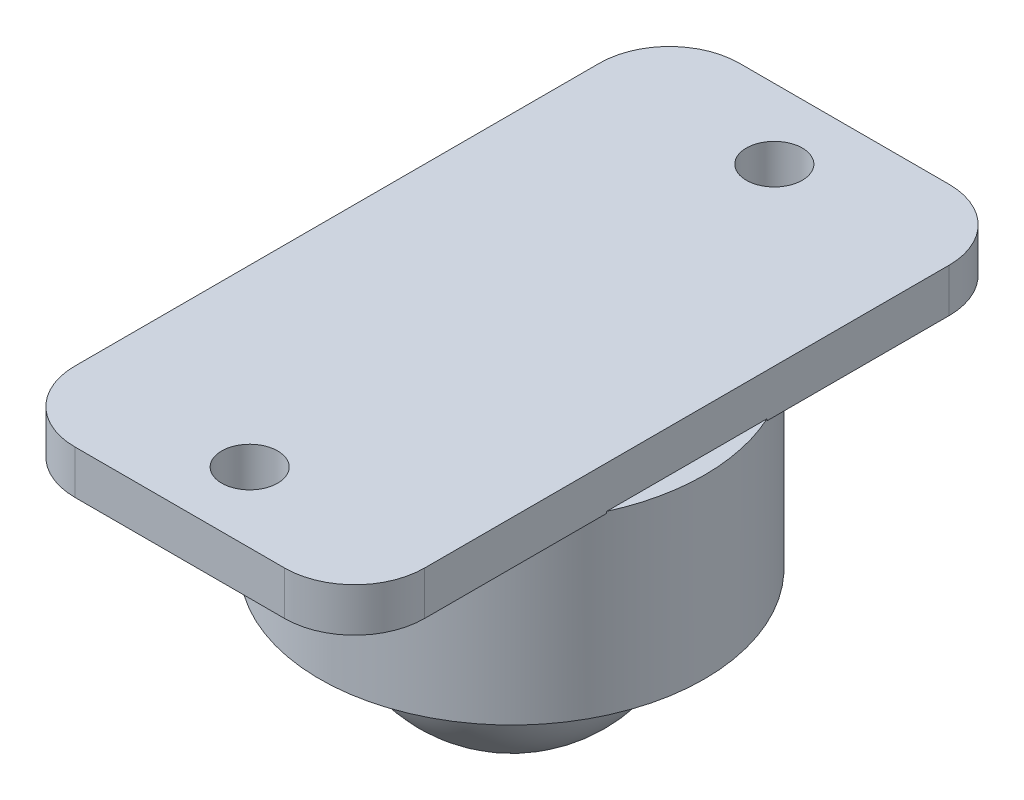
ISO-10303-21;
HEADER;
FILE_DESCRIPTION(('STEP AP214'),'2;1');
FILE_NAME('part.step','',(''),(''),'','','');
FILE_SCHEMA(('AUTOMOTIVE_DESIGN { 1 0 10303 214 1 1 1 1 }'));
ENDSEC;
DATA;
#1=APPLICATION_CONTEXT('core data for automotive mechanical design processes');
#2=APPLICATION_PROTOCOL_DEFINITION('international standard','automotive_design',2000,#1);
#3=PRODUCT_CONTEXT('',#1,'mechanical');
#4=PRODUCT('Part','Part','',(#3));
#5=PRODUCT_RELATED_PRODUCT_CATEGORY('part','',(#4));
#6=PRODUCT_DEFINITION_FORMATION('','',#4);
#7=PRODUCT_DEFINITION_CONTEXT('part definition',#1,'design');
#8=PRODUCT_DEFINITION('design','',#6,#7);
#9=PRODUCT_DEFINITION_SHAPE('','',#8);
#10=(LENGTH_UNIT() NAMED_UNIT(*) SI_UNIT(.MILLI.,.METRE.));
#11=(NAMED_UNIT(*) PLANE_ANGLE_UNIT() SI_UNIT($,.RADIAN.));
#12=(NAMED_UNIT(*) SI_UNIT($,.STERADIAN.) SOLID_ANGLE_UNIT());
#13=UNCERTAINTY_MEASURE_WITH_UNIT(LENGTH_MEASURE(1.E-05),#10,'distance_accuracy_value','');
#14=(GEOMETRIC_REPRESENTATION_CONTEXT(3) GLOBAL_UNCERTAINTY_ASSIGNED_CONTEXT((#13)) GLOBAL_UNIT_ASSIGNED_CONTEXT((#10,
#11,#12)) REPRESENTATION_CONTEXT('',''));
#15=CARTESIAN_POINT('',(0.,0.,0.));
#16=DIRECTION('',(0.,0.,1.));
#17=DIRECTION('',(1.,0.,0.));
#18=AXIS2_PLACEMENT_3D('',#15,#16,#17);
#19=CARTESIAN_POINT('',(283.05,457.1,512.72));
#20=DIRECTION('',(0.,0.,1.));
#21=DIRECTION('',(1.,0.,0.));
#22=AXIS2_PLACEMENT_3D('',#19,#20,#21);
#23=SPHERICAL_SURFACE('',#22,7.8);
#24=CARTESIAN_POINT('',(283.05,457.1,512.72));
#25=DIRECTION('',(0.,-1.,0.));
#26=DIRECTION('',(1.,0.,0.));
#27=AXIS2_PLACEMENT_3D('',#24,#25,#26);
#28=SPHERICAL_SURFACE('',#27,7.8);
#29=CARTESIAN_POINT('',(283.05,457.1,512.72));
#30=DIRECTION('',(0.,-1.,0.));
#31=DIRECTION('',(1.,0.,0.));
#32=AXIS2_PLACEMENT_3D('',#29,#30,#31);
#33=CIRCLE('',#32,7.8);
#34=CARTESIAN_POINT('',(283.05,457.1,504.92));
#35=VERTEX_POINT('',#34);
#36=CARTESIAN_POINT('',(283.05,457.1,520.52));
#37=VERTEX_POINT('',#36);
#38=EDGE_CURVE('P0_E38',#35,#37,#33,.T.);
#39=ORIENTED_EDGE('',*,*,#38,.T.);
#40=CARTESIAN_POINT('',(283.05,457.1,512.72));
#41=DIRECTION('',(0.,-1.,0.));
#42=DIRECTION('',(0.,0.,-1.));
#43=AXIS2_PLACEMENT_3D('',#40,#41,#42);
#44=CIRCLE('',#43,7.8);
#45=EDGE_CURVE('P0_E168',#37,#35,#44,.T.);
#46=ORIENTED_EDGE('',*,*,#45,.T.);
#47=EDGE_LOOP('',(#39,#46));
#48=FACE_BOUND('',#47,.T.);
#49=ADVANCED_FACE('P0_F17',(#48),#28,.F.);
#50=CARTESIAN_POINT('',(283.05,464.6,527.72));
#51=DIRECTION('',(0.,-1.,0.));
#52=DIRECTION('',(1.,0.,0.));
#53=AXIS2_PLACEMENT_3D('',#50,#51,#52);
#54=CYLINDRICAL_SURFACE('',#53,1.6);
#55=DIRECTION('',(0.,1.,0.));
#56=VECTOR('',#55,1.);
#57=CARTESIAN_POINT('',(284.65,464.6,527.72));
#58=LINE('',#57,#56);
#59=CARTESIAN_POINT('',(284.65,467.1,527.72));
#60=VERTEX_POINT('',#59);
#61=CARTESIAN_POINT('',(284.65,469.6,527.72));
#62=VERTEX_POINT('',#61);
#63=EDGE_CURVE('P0_E11',#60,#62,#58,.T.);
#64=ORIENTED_EDGE('',*,*,#63,.T.);
#65=CARTESIAN_POINT('',(283.05,469.6,527.72));
#66=DIRECTION('',(0.,-1.,0.));
#67=DIRECTION('',(1.,0.,0.));
#68=AXIS2_PLACEMENT_3D('',#65,#66,#67);
#69=CIRCLE('',#68,1.6);
#70=EDGE_CURVE('P0_E175',#62,#62,#69,.T.);
#71=ORIENTED_EDGE('',*,*,#70,.F.);
#72=ORIENTED_EDGE('',*,*,#63,.F.);
#73=CARTESIAN_POINT('',(283.05,467.1,527.72));
#74=DIRECTION('',(0.,-1.,0.));
#75=DIRECTION('',(1.,0.,0.));
#76=AXIS2_PLACEMENT_3D('',#73,#74,#75);
#77=CIRCLE('',#76,1.6);
#78=EDGE_CURVE('P0_E247',#60,#60,#77,.T.);
#79=ORIENTED_EDGE('',*,*,#78,.T.);
#80=EDGE_LOOP('',(#64,#71,#72,#79));
#81=FACE_BOUND('',#80,.T.);
#82=ADVANCED_FACE('P0_F391',(#81),#54,.F.);
#83=CARTESIAN_POINT('',(273.05,467.1,531.72));
#84=DIRECTION('',(0.,0.,1.));
#85=DIRECTION('',(1.,0.,0.));
#86=AXIS2_PLACEMENT_3D('',#83,#84,#85);
#87=PLANE('',#86);
#88=DIRECTION('',(1.,0.,0.));
#89=VECTOR('',#88,1.);
#90=CARTESIAN_POINT('',(273.05,469.6,531.72));
#91=LINE('',#90,#89);
#92=CARTESIAN_POINT('',(277.05,469.6,531.72));
#93=VERTEX_POINT('',#92);
#94=CARTESIAN_POINT('',(289.05,469.6,531.72));
#95=VERTEX_POINT('',#94);
#96=EDGE_CURVE('P0_E261',#93,#95,#91,.T.);
#97=ORIENTED_EDGE('',*,*,#96,.F.);
#98=DIRECTION('',(0.,1.,0.));
#99=VECTOR('',#98,1.);
#100=CARTESIAN_POINT('',(277.05,467.1,531.72));
#101=LINE('',#100,#99);
#102=CARTESIAN_POINT('',(277.05,467.1,531.72));
#103=VERTEX_POINT('',#102);
#104=EDGE_CURVE('P0_E251',#103,#93,#101,.T.);
#105=ORIENTED_EDGE('',*,*,#104,.F.);
#106=DIRECTION('',(1.,0.,0.));
#107=VECTOR('',#106,1.);
#108=CARTESIAN_POINT('',(273.05,467.1,531.72));
#109=LINE('',#108,#107);
#110=CARTESIAN_POINT('',(289.05,467.1,531.72));
#111=VERTEX_POINT('',#110);
#112=EDGE_CURVE('P0_E229',#103,#111,#109,.T.);
#113=ORIENTED_EDGE('',*,*,#112,.T.);
#114=DIRECTION('',(0.,1.,0.));
#115=VECTOR('',#114,1.);
#116=CARTESIAN_POINT('',(289.05,467.1,531.72));
#117=LINE('',#116,#115);
#118=EDGE_CURVE('P0_E26',#111,#95,#117,.T.);
#119=ORIENTED_EDGE('',*,*,#118,.T.);
#120=EDGE_LOOP('',(#97,#105,#113,#119));
#121=FACE_BOUND('',#120,.T.);
#122=ADVANCED_FACE('P0_F389',(#121),#87,.T.);
#123=CARTESIAN_POINT('',(289.05,467.1,527.72));
#124=DIRECTION('',(0.,1.,0.));
#125=DIRECTION('',(1.,0.,0.));
#126=AXIS2_PLACEMENT_3D('',#123,#124,#125);
#127=CYLINDRICAL_SURFACE('',#126,4.);
#128=DIRECTION('',(0.,1.,0.));
#129=VECTOR('',#128,1.);
#130=CARTESIAN_POINT('',(293.05,467.1,527.72));
#131=LINE('',#130,#129);
#132=CARTESIAN_POINT('',(293.05,467.1,527.72));
#133=VERTEX_POINT('',#132);
#134=CARTESIAN_POINT('',(293.05,469.6,527.72));
#135=VERTEX_POINT('',#134);
#136=EDGE_CURVE('P0_E196',#133,#135,#131,.T.);
#137=ORIENTED_EDGE('',*,*,#136,.T.);
#138=CARTESIAN_POINT('',(289.05,469.6,527.72));
#139=DIRECTION('',(0.,-1.,0.));
#140=DIRECTION('',(0.,0.,1.));
#141=AXIS2_PLACEMENT_3D('',#138,#139,#140);
#142=CIRCLE('',#141,4.);
#143=EDGE_CURVE('P0_E265',#135,#95,#142,.T.);
#144=ORIENTED_EDGE('',*,*,#143,.T.);
#145=ORIENTED_EDGE('',*,*,#118,.F.);
#146=CARTESIAN_POINT('',(289.05,467.1,527.72));
#147=DIRECTION('',(0.,-1.,0.));
#148=DIRECTION('',(0.,0.,1.));
#149=AXIS2_PLACEMENT_3D('',#146,#147,#148);
#150=CIRCLE('',#149,4.);
#151=EDGE_CURVE('P0_E233',#133,#111,#150,.T.);
#152=ORIENTED_EDGE('',*,*,#151,.F.);
#153=EDGE_LOOP('',(#137,#144,#145,#152));
#154=FACE_BOUND('',#153,.T.);
#155=ADVANCED_FACE('P0_F276',(#154),#127,.T.);
#156=CARTESIAN_POINT('',(283.05,467.2,512.72));
#157=DIRECTION('',(0.,-1.,0.));
#158=DIRECTION('',(0.,0.,-1.));
#159=AXIS2_PLACEMENT_3D('',#156,#157,#158);
#160=PLANE('',#159);
#161=DIRECTION('',(0.,0.,-1.));
#162=VECTOR('',#161,1.);
#163=CARTESIAN_POINT('',(293.05,467.2,503.22));
#164=LINE('',#163,#162);
#165=CARTESIAN_POINT('',(293.05,467.2,517.30257569495));
#166=VERTEX_POINT('',#165);
#167=CARTESIAN_POINT('',(293.05,467.2,508.13742430504));
#168=VERTEX_POINT('',#167);
#169=EDGE_CURVE('P0_E169',#166,#168,#164,.T.);
#170=ORIENTED_EDGE('',*,*,#169,.F.);
#171=CARTESIAN_POINT('',(283.05,467.2,512.72));
#172=DIRECTION('',(0.,-1.,0.));
#173=DIRECTION('',(1.,0.,0.));
#174=AXIS2_PLACEMENT_3D('',#171,#172,#173);
#175=CIRCLE('',#174,11.);
#176=CARTESIAN_POINT('',(294.05,467.2,512.72));
#177=VERTEX_POINT('',#176);
#178=EDGE_CURVE('P0_E217',#177,#166,#175,.T.);
#179=ORIENTED_EDGE('',*,*,#178,.F.);
#180=CARTESIAN_POINT('',(283.05,467.2,512.72));
#181=DIRECTION('',(0.,-1.,0.));
#182=DIRECTION('',(1.,0.,0.));
#183=AXIS2_PLACEMENT_3D('',#180,#181,#182);
#184=CIRCLE('',#183,11.);
#185=EDGE_CURVE('P0_E240',#168,#177,#184,.T.);
#186=ORIENTED_EDGE('',*,*,#185,.F.);
#187=EDGE_LOOP('',(#170,#179,#186));
#188=FACE_BOUND('',#187,.T.);
#189=ADVANCED_FACE('P0_F399',(#188),#160,.F.);
#190=CARTESIAN_POINT('',(283.05,457.1,512.72));
#191=DIRECTION('',(0.,-1.,0.));
#192=DIRECTION('',(0.,0.,-1.));
#193=AXIS2_PLACEMENT_3D('',#190,#191,#192);
#194=PLANE('',#193);
#195=ORIENTED_EDGE('',*,*,#45,.F.);
#196=ORIENTED_EDGE('',*,*,#38,.F.);
#197=EDGE_LOOP('',(#195,#196));
#198=FACE_BOUND('',#197,.T.);
#199=CARTESIAN_POINT('',(283.05,457.1,512.72));
#200=DIRECTION('',(0.,-1.,0.));
#201=DIRECTION('',(1.,0.,0.));
#202=AXIS2_PLACEMENT_3D('',#199,#200,#201);
#203=CIRCLE('',#202,11.);
#204=CARTESIAN_POINT('',(294.05,457.1,512.72));
#205=VERTEX_POINT('',#204);
#206=EDGE_CURVE('P0_E325',#205,#205,#203,.T.);
#207=ORIENTED_EDGE('',*,*,#206,.T.);
#208=EDGE_LOOP('',(#207));
#209=FACE_BOUND('',#208,.T.);
#210=ADVANCED_FACE('P0_F439',(#198,#209),#194,.T.);
#211=CARTESIAN_POINT('',(283.05,464.6,497.72));
#212=DIRECTION('',(0.,-1.,0.));
#213=DIRECTION('',(1.,0.,0.));
#214=AXIS2_PLACEMENT_3D('',#211,#212,#213);
#215=CYLINDRICAL_SURFACE('',#214,1.6);
#216=DIRECTION('',(0.,1.,0.));
#217=VECTOR('',#216,1.);
#218=CARTESIAN_POINT('',(284.65,464.6,497.72));
#219=LINE('',#218,#217);
#220=CARTESIAN_POINT('',(284.65,467.1,497.72));
#221=VERTEX_POINT('',#220);
#222=CARTESIAN_POINT('',(284.65,469.6,497.72));
#223=VERTEX_POINT('',#222);
#224=EDGE_CURVE('P0_E161',#221,#223,#219,.T.);
#225=ORIENTED_EDGE('',*,*,#224,.T.);
#226=CARTESIAN_POINT('',(283.05,469.6,497.72));
#227=DIRECTION('',(0.,-1.,0.));
#228=DIRECTION('',(1.,0.,0.));
#229=AXIS2_PLACEMENT_3D('',#226,#227,#228);
#230=CIRCLE('',#229,1.6);
#231=EDGE_CURVE('P0_E164',#223,#223,#230,.T.);
#232=ORIENTED_EDGE('',*,*,#231,.F.);
#233=ORIENTED_EDGE('',*,*,#224,.F.);
#234=CARTESIAN_POINT('',(283.05,467.1,497.72));
#235=DIRECTION('',(0.,-1.,0.));
#236=DIRECTION('',(1.,0.,0.));
#237=AXIS2_PLACEMENT_3D('',#234,#235,#236);
#238=CIRCLE('',#237,1.6);
#239=EDGE_CURVE('P0_E166',#221,#221,#238,.T.);
#240=ORIENTED_EDGE('',*,*,#239,.T.);
#241=EDGE_LOOP('',(#225,#232,#233,#240));
#242=FACE_BOUND('',#241,.T.);
#243=ADVANCED_FACE('P0_F163',(#242),#215,.F.);
#244=CARTESIAN_POINT('',(293.05,467.1,493.72));
#245=DIRECTION('',(1.,0.,0.));
#246=DIRECTION('',(0.,1.,0.));
#247=AXIS2_PLACEMENT_3D('',#244,#245,#246);
#248=PLANE('',#247);
#249=DIRECTION('',(0.,0.,1.));
#250=VECTOR('',#249,1.);
#251=CARTESIAN_POINT('',(293.05,467.1,493.72));
#252=LINE('',#251,#250);
#253=CARTESIAN_POINT('',(293.05,467.1,497.72));
#254=VERTEX_POINT('',#253);
#255=CARTESIAN_POINT('',(293.05,467.1,508.13742430504));
#256=VERTEX_POINT('',#255);
#257=EDGE_CURVE('P0_E324',#254,#256,#252,.T.);
#258=ORIENTED_EDGE('',*,*,#257,.F.);
#259=DIRECTION('',(0.,1.,0.));
#260=VECTOR('',#259,1.);
#261=CARTESIAN_POINT('',(293.05,467.1,497.72));
#262=LINE('',#261,#260);
#263=CARTESIAN_POINT('',(293.05,469.6,497.72));
#264=VERTEX_POINT('',#263);
#265=EDGE_CURVE('P0_E153',#254,#264,#262,.T.);
#266=ORIENTED_EDGE('',*,*,#265,.T.);
#267=DIRECTION('',(0.,0.,1.));
#268=VECTOR('',#267,1.);
#269=CARTESIAN_POINT('',(293.05,469.6,493.72));
#270=LINE('',#269,#268);
#271=EDGE_CURVE('P0_E185',#264,#135,#270,.T.);
#272=ORIENTED_EDGE('',*,*,#271,.T.);
#273=ORIENTED_EDGE('',*,*,#136,.F.);
#274=DIRECTION('',(0.,0.,1.));
#275=VECTOR('',#274,1.);
#276=CARTESIAN_POINT('',(293.05,467.1,493.72));
#277=LINE('',#276,#275);
#278=CARTESIAN_POINT('',(293.05,467.1,517.30257569495));
#279=VERTEX_POINT('',#278);
#280=EDGE_CURVE('P0_E243',#279,#133,#277,.T.);
#281=ORIENTED_EDGE('',*,*,#280,.F.);
#282=DIRECTION('',(0.,-1.,0.));
#283=VECTOR('',#282,1.);
#284=CARTESIAN_POINT('',(293.05,457.1,517.30257569495));
#285=LINE('',#284,#283);
#286=EDGE_CURVE('P0_E220',#166,#279,#285,.T.);
#287=ORIENTED_EDGE('',*,*,#286,.F.);
#288=ORIENTED_EDGE('',*,*,#169,.T.);
#289=DIRECTION('',(0.,-1.,0.));
#290=VECTOR('',#289,1.);
#291=CARTESIAN_POINT('',(293.05,457.1,508.13742430504));
#292=LINE('',#291,#290);
#293=EDGE_CURVE('P0_E237',#168,#256,#292,.T.);
#294=ORIENTED_EDGE('',*,*,#293,.T.);
#295=EDGE_LOOP('',(#258,#266,#272,#273,#281,#287,#288,#294));
#296=FACE_BOUND('',#295,.T.);
#297=ADVANCED_FACE('P0_F271',(#296),#248,.T.);
#298=CARTESIAN_POINT('',(289.05,467.1,497.72));
#299=DIRECTION('',(0.,1.,0.));
#300=DIRECTION('',(1.,0.,0.));
#301=AXIS2_PLACEMENT_3D('',#298,#299,#300);
#302=CYLINDRICAL_SURFACE('',#301,4.);
#303=CARTESIAN_POINT('',(289.05,467.1,497.72));
#304=DIRECTION('',(0.,1.,0.));
#305=DIRECTION('',(0.,0.,1.));
#306=AXIS2_PLACEMENT_3D('',#303,#304,#305);
#307=CIRCLE('',#306,4.);
#308=CARTESIAN_POINT('',(289.05,467.1,493.72));
#309=VERTEX_POINT('',#308);
#310=EDGE_CURVE('P0_E320',#254,#309,#307,.T.);
#311=ORIENTED_EDGE('',*,*,#310,.T.);
#312=DIRECTION('',(0.,1.,0.));
#313=VECTOR('',#312,1.);
#314=CARTESIAN_POINT('',(289.05,467.1,493.72));
#315=LINE('',#314,#313);
#316=CARTESIAN_POINT('',(289.05,469.6,493.72));
#317=VERTEX_POINT('',#316);
#318=EDGE_CURVE('P0_E191',#309,#317,#315,.T.);
#319=ORIENTED_EDGE('',*,*,#318,.T.);
#320=CARTESIAN_POINT('',(289.05,469.6,497.72));
#321=DIRECTION('',(0.,1.,0.));
#322=DIRECTION('',(0.,0.,1.));
#323=AXIS2_PLACEMENT_3D('',#320,#321,#322);
#324=CIRCLE('',#323,4.);
#325=EDGE_CURVE('P0_E176',#264,#317,#324,.T.);
#326=ORIENTED_EDGE('',*,*,#325,.F.);
#327=ORIENTED_EDGE('',*,*,#265,.F.);
#328=EDGE_LOOP('',(#311,#319,#326,#327));
#329=FACE_BOUND('',#328,.T.);
#330=ADVANCED_FACE('P0_F348',(#329),#302,.T.);
#331=CARTESIAN_POINT('',(273.05,467.1,493.72));
#332=DIRECTION('',(0.,0.,1.));
#333=DIRECTION('',(1.,0.,0.));
#334=AXIS2_PLACEMENT_3D('',#331,#332,#333);
#335=PLANE('',#334);
#336=ORIENTED_EDGE('',*,*,#318,.F.);
#337=DIRECTION('',(1.,0.,0.));
#338=VECTOR('',#337,1.);
#339=CARTESIAN_POINT('',(273.05,467.1,493.72));
#340=LINE('',#339,#338);
#341=CARTESIAN_POINT('',(277.05,467.1,493.72));
#342=VERTEX_POINT('',#341);
#343=EDGE_CURVE('P0_E304',#342,#309,#340,.T.);
#344=ORIENTED_EDGE('',*,*,#343,.F.);
#345=DIRECTION('',(0.,1.,0.));
#346=VECTOR('',#345,1.);
#347=CARTESIAN_POINT('',(277.05,467.1,493.72));
#348=LINE('',#347,#346);
#349=CARTESIAN_POINT('',(277.05,469.6,493.72));
#350=VERTEX_POINT('',#349);
#351=EDGE_CURVE('P0_E182',#342,#350,#348,.T.);
#352=ORIENTED_EDGE('',*,*,#351,.T.);
#353=DIRECTION('',(1.,0.,0.));
#354=VECTOR('',#353,1.);
#355=CARTESIAN_POINT('',(273.05,469.6,493.72));
#356=LINE('',#355,#354);
#357=EDGE_CURVE('P0_E252',#350,#317,#356,.T.);
#358=ORIENTED_EDGE('',*,*,#357,.T.);
#359=EDGE_LOOP('',(#336,#344,#352,#358));
#360=FACE_BOUND('',#359,.T.);
#361=ADVANCED_FACE('P0_F477',(#360),#335,.F.);
#362=CARTESIAN_POINT('',(277.05,467.1,497.72));
#363=DIRECTION('',(0.,1.,0.));
#364=DIRECTION('',(-1.,0.,0.));
#365=AXIS2_PLACEMENT_3D('',#362,#363,#364);
#366=CYLINDRICAL_SURFACE('',#365,4.);
#367=DIRECTION('',(0.,1.,0.));
#368=VECTOR('',#367,1.);
#369=CARTESIAN_POINT('',(273.05,467.1,497.72));
#370=LINE('',#369,#368);
#371=CARTESIAN_POINT('',(273.05,467.1,497.72));
#372=VERTEX_POINT('',#371);
#373=CARTESIAN_POINT('',(273.05,469.6,497.72));
#374=VERTEX_POINT('',#373);
#375=EDGE_CURVE('P0_E311',#372,#374,#370,.T.);
#376=ORIENTED_EDGE('',*,*,#375,.T.);
#377=CARTESIAN_POINT('',(277.05,469.6,497.72));
#378=DIRECTION('',(0.,-1.,0.));
#379=DIRECTION('',(0.,0.,1.));
#380=AXIS2_PLACEMENT_3D('',#377,#378,#379);
#381=CIRCLE('',#380,4.);
#382=EDGE_CURVE('P0_E256',#374,#350,#381,.T.);
#383=ORIENTED_EDGE('',*,*,#382,.T.);
#384=ORIENTED_EDGE('',*,*,#351,.F.);
#385=CARTESIAN_POINT('',(277.05,467.1,497.72));
#386=DIRECTION('',(0.,-1.,0.));
#387=DIRECTION('',(0.,0.,1.));
#388=AXIS2_PLACEMENT_3D('',#385,#386,#387);
#389=CIRCLE('',#388,4.);
#390=EDGE_CURVE('P0_E300',#372,#342,#389,.T.);
#391=ORIENTED_EDGE('',*,*,#390,.F.);
#392=EDGE_LOOP('',(#376,#383,#384,#391));
#393=FACE_BOUND('',#392,.T.);
#394=ADVANCED_FACE('P0_F382',(#393),#366,.T.);
#395=CARTESIAN_POINT('',(273.05,469.6,493.72));
#396=DIRECTION('',(0.,1.,0.));
#397=DIRECTION('',(1.,0.,0.));
#398=AXIS2_PLACEMENT_3D('',#395,#396,#397);
#399=PLANE('',#398);
#400=ORIENTED_EDGE('',*,*,#70,.T.);
#401=EDGE_LOOP('',(#400));
#402=FACE_BOUND('',#401,.T.);
#403=ORIENTED_EDGE('',*,*,#231,.T.);
#404=EDGE_LOOP('',(#403));
#405=FACE_BOUND('',#404,.T.);
#406=ORIENTED_EDGE('',*,*,#357,.F.);
#407=ORIENTED_EDGE('',*,*,#382,.F.);
#408=DIRECTION('',(0.,0.,1.));
#409=VECTOR('',#408,1.);
#410=CARTESIAN_POINT('',(273.05,469.6,493.72));
#411=LINE('',#410,#409);
#412=CARTESIAN_POINT('',(273.05,469.6,527.72));
#413=VERTEX_POINT('',#412);
#414=EDGE_CURVE('P0_E298',#374,#413,#411,.T.);
#415=ORIENTED_EDGE('',*,*,#414,.T.);
#416=CARTESIAN_POINT('',(277.05,469.6,527.72));
#417=DIRECTION('',(0.,1.,0.));
#418=DIRECTION('',(0.,0.,1.));
#419=AXIS2_PLACEMENT_3D('',#416,#417,#418);
#420=CIRCLE('',#419,4.);
#421=EDGE_CURVE('P0_E257',#413,#93,#420,.T.);
#422=ORIENTED_EDGE('',*,*,#421,.T.);
#423=ORIENTED_EDGE('',*,*,#96,.T.);
#424=ORIENTED_EDGE('',*,*,#143,.F.);
#425=ORIENTED_EDGE('',*,*,#271,.F.);
#426=ORIENTED_EDGE('',*,*,#325,.T.);
#427=EDGE_LOOP('',(#406,#407,#415,#422,#423,#424,#425,#426));
#428=FACE_BOUND('',#427,.T.);
#429=ADVANCED_FACE('P0_F172',(#402,#405,#428),#399,.T.);
#430=CARTESIAN_POINT('',(277.05,467.1,527.72));
#431=DIRECTION('',(0.,1.,0.));
#432=DIRECTION('',(-1.,0.,0.));
#433=AXIS2_PLACEMENT_3D('',#430,#431,#432);
#434=CYLINDRICAL_SURFACE('',#433,4.);
#435=CARTESIAN_POINT('',(277.05,467.1,527.72));
#436=DIRECTION('',(0.,1.,0.));
#437=DIRECTION('',(0.,0.,1.));
#438=AXIS2_PLACEMENT_3D('',#435,#436,#437);
#439=CIRCLE('',#438,4.);
#440=CARTESIAN_POINT('',(273.05,467.1,527.72));
#441=VERTEX_POINT('',#440);
#442=EDGE_CURVE('P0_E232',#441,#103,#439,.T.);
#443=ORIENTED_EDGE('',*,*,#442,.T.);
#444=ORIENTED_EDGE('',*,*,#104,.T.);
#445=ORIENTED_EDGE('',*,*,#421,.F.);
#446=DIRECTION('',(0.,1.,0.));
#447=VECTOR('',#446,1.);
#448=CARTESIAN_POINT('',(273.05,467.1,527.72));
#449=LINE('',#448,#447);
#450=EDGE_CURVE('P0_E295',#441,#413,#449,.T.);
#451=ORIENTED_EDGE('',*,*,#450,.F.);
#452=EDGE_LOOP('',(#443,#444,#445,#451));
#453=FACE_BOUND('',#452,.T.);
#454=ADVANCED_FACE('P0_F380',(#453),#434,.T.);
#455=CARTESIAN_POINT('',(273.05,467.1,493.72));
#456=DIRECTION('',(0.,1.,0.));
#457=DIRECTION('',(1.,0.,0.));
#458=AXIS2_PLACEMENT_3D('',#455,#456,#457);
#459=PLANE('',#458);
#460=ORIENTED_EDGE('',*,*,#78,.F.);
#461=EDGE_LOOP('',(#460));
#462=FACE_BOUND('',#461,.T.);
#463=ORIENTED_EDGE('',*,*,#280,.T.);
#464=ORIENTED_EDGE('',*,*,#151,.T.);
#465=ORIENTED_EDGE('',*,*,#112,.F.);
#466=ORIENTED_EDGE('',*,*,#442,.F.);
#467=DIRECTION('',(0.,0.,1.));
#468=VECTOR('',#467,1.);
#469=CARTESIAN_POINT('',(273.05,467.1,493.72));
#470=LINE('',#469,#468);
#471=CARTESIAN_POINT('',(273.05,467.1,517.30257569495));
#472=VERTEX_POINT('',#471);
#473=EDGE_CURVE('P0_E299',#472,#441,#470,.T.);
#474=ORIENTED_EDGE('',*,*,#473,.F.);
#475=CARTESIAN_POINT('',(283.05,467.1,512.72));
#476=DIRECTION('',(0.,-1.,0.));
#477=DIRECTION('',(1.,0.,0.));
#478=AXIS2_PLACEMENT_3D('',#475,#476,#477);
#479=CIRCLE('',#478,11.);
#480=EDGE_CURVE('P0_E225',#279,#472,#479,.T.);
#481=ORIENTED_EDGE('',*,*,#480,.F.);
#482=EDGE_LOOP('',(#463,#464,#465,#466,#474,#481));
#483=FACE_BOUND('',#482,.T.);
#484=ADVANCED_FACE('P0_F284',(#462,#483),#459,.F.);
#485=CARTESIAN_POINT('',(283.05,467.2,512.72));
#486=DIRECTION('',(0.,-1.,0.));
#487=DIRECTION('',(0.,0.,-1.));
#488=AXIS2_PLACEMENT_3D('',#485,#486,#487);
#489=PLANE('',#488);
#490=CARTESIAN_POINT('',(283.05,467.2,512.72));
#491=DIRECTION('',(0.,-1.,0.));
#492=DIRECTION('',(1.,0.,0.));
#493=AXIS2_PLACEMENT_3D('',#490,#491,#492);
#494=CIRCLE('',#493,11.);
#495=CARTESIAN_POINT('',(273.05,467.2,517.30257569495));
#496=VERTEX_POINT('',#495);
#497=CARTESIAN_POINT('',(273.05,467.2,508.13742430504));
#498=VERTEX_POINT('',#497);
#499=EDGE_CURVE('P0_E228',#496,#498,#494,.T.);
#500=ORIENTED_EDGE('',*,*,#499,.F.);
#501=DIRECTION('',(0.,0.,-1.));
#502=VECTOR('',#501,1.);
#503=CARTESIAN_POINT('',(273.05,467.2,503.22));
#504=LINE('',#503,#502);
#505=EDGE_CURVE('P0_E364',#496,#498,#504,.T.);
#506=ORIENTED_EDGE('',*,*,#505,.T.);
#507=EDGE_LOOP('',(#500,#506));
#508=FACE_BOUND('',#507,.T.);
#509=ADVANCED_FACE('P0_F524',(#508),#489,.F.);
#510=CARTESIAN_POINT('',(283.05,457.1,512.72));
#511=DIRECTION('',(0.,-1.,0.));
#512=DIRECTION('',(1.,0.,0.));
#513=AXIS2_PLACEMENT_3D('',#510,#511,#512);
#514=CYLINDRICAL_SURFACE('',#513,11.);
#515=ORIENTED_EDGE('',*,*,#206,.F.);
#516=DIRECTION('',(0.,1.,0.));
#517=VECTOR('',#516,1.);
#518=CARTESIAN_POINT('',(294.05,457.1,512.72));
#519=LINE('',#518,#517);
#520=EDGE_CURVE('P0_E221',#205,#177,#519,.T.);
#521=ORIENTED_EDGE('',*,*,#520,.T.);
#522=ORIENTED_EDGE('',*,*,#178,.T.);
#523=ORIENTED_EDGE('',*,*,#286,.T.);
#524=ORIENTED_EDGE('',*,*,#480,.T.);
#525=DIRECTION('',(0.,-1.,0.));
#526=VECTOR('',#525,1.);
#527=CARTESIAN_POINT('',(273.05,457.1,517.30257569495));
#528=LINE('',#527,#526);
#529=EDGE_CURVE('P0_E369',#496,#472,#528,.T.);
#530=ORIENTED_EDGE('',*,*,#529,.F.);
#531=ORIENTED_EDGE('',*,*,#499,.T.);
#532=DIRECTION('',(0.,-1.,0.));
#533=VECTOR('',#532,1.);
#534=CARTESIAN_POINT('',(273.05,457.1,508.13742430504));
#535=LINE('',#534,#533);
#536=CARTESIAN_POINT('',(273.05,467.1,508.13742430504));
#537=VERTEX_POINT('',#536);
#538=EDGE_CURVE('P0_E357',#498,#537,#535,.T.);
#539=ORIENTED_EDGE('',*,*,#538,.T.);
#540=CARTESIAN_POINT('',(283.05,467.1,512.72));
#541=DIRECTION('',(0.,-1.,0.));
#542=DIRECTION('',(1.,0.,0.));
#543=AXIS2_PLACEMENT_3D('',#540,#541,#542);
#544=CIRCLE('',#543,11.);
#545=EDGE_CURVE('P0_E305',#537,#256,#544,.T.);
#546=ORIENTED_EDGE('',*,*,#545,.T.);
#547=ORIENTED_EDGE('',*,*,#293,.F.);
#548=ORIENTED_EDGE('',*,*,#185,.T.);
#549=ORIENTED_EDGE('',*,*,#520,.F.);
#550=EDGE_LOOP('',(#515,#521,#522,#523,#524,#530,#531,#539,#546,#547,#548,#549));
#551=FACE_BOUND('',#550,.T.);
#552=ADVANCED_FACE('P0_F360',(#551),#514,.T.);
#553=CARTESIAN_POINT('',(273.05,467.1,493.72));
#554=DIRECTION('',(0.,1.,0.));
#555=DIRECTION('',(1.,0.,0.));
#556=AXIS2_PLACEMENT_3D('',#553,#554,#555);
#557=PLANE('',#556);
#558=ORIENTED_EDGE('',*,*,#239,.F.);
#559=EDGE_LOOP('',(#558));
#560=FACE_BOUND('',#559,.T.);
#561=ORIENTED_EDGE('',*,*,#310,.F.);
#562=ORIENTED_EDGE('',*,*,#257,.T.);
#563=ORIENTED_EDGE('',*,*,#545,.F.);
#564=DIRECTION('',(0.,0.,1.));
#565=VECTOR('',#564,1.);
#566=CARTESIAN_POINT('',(273.05,467.1,493.72));
#567=LINE('',#566,#565);
#568=EDGE_CURVE('P0_E316',#372,#537,#567,.T.);
#569=ORIENTED_EDGE('',*,*,#568,.F.);
#570=ORIENTED_EDGE('',*,*,#390,.T.);
#571=ORIENTED_EDGE('',*,*,#343,.T.);
#572=EDGE_LOOP('',(#561,#562,#563,#569,#570,#571));
#573=FACE_BOUND('',#572,.T.);
#574=ADVANCED_FACE('P0_F343',(#560,#573),#557,.F.);
#575=CARTESIAN_POINT('',(273.05,467.1,493.72));
#576=DIRECTION('',(1.,0.,0.));
#577=DIRECTION('',(0.,1.,0.));
#578=AXIS2_PLACEMENT_3D('',#575,#576,#577);
#579=PLANE('',#578);
#580=ORIENTED_EDGE('',*,*,#538,.F.);
#581=ORIENTED_EDGE('',*,*,#505,.F.);
#582=ORIENTED_EDGE('',*,*,#529,.T.);
#583=ORIENTED_EDGE('',*,*,#473,.T.);
#584=ORIENTED_EDGE('',*,*,#450,.T.);
#585=ORIENTED_EDGE('',*,*,#414,.F.);
#586=ORIENTED_EDGE('',*,*,#375,.F.);
#587=ORIENTED_EDGE('',*,*,#568,.T.);
#588=EDGE_LOOP('',(#580,#581,#582,#583,#584,#585,#586,#587));
#589=FACE_BOUND('',#588,.T.);
#590=ADVANCED_FACE('P0_F355',(#589),#579,.F.);
#591=CLOSED_SHELL('',(#49,#82,#122,#155,#189,#210,#243,#297,#330,#361,#394,#429,#454,#484,#509,
#552,#574,#590));
#592=MANIFOLD_SOLID_BREP('P0_B1',#591);
#593=CARTESIAN_POINT('',(283.05,457.1,512.72));
#594=DIRECTION('',(0.,0.,1.));
#595=DIRECTION('',(1.,0.,0.));
#596=AXIS2_PLACEMENT_3D('',#593,#594,#595);
#597=SPHERICAL_SURFACE('',#596,7.5);
#598=CARTESIAN_POINT('',(283.05,457.1,505.22));
#599=VERTEX_POINT('',#598);
#600=VERTEX_LOOP('',#599);
#601=FACE_BOUND('',#600,.T.);
#602=ADVANCED_FACE('P1_F14',(#601),#597,.T.);
#603=CLOSED_SHELL('',(#602));
#604=MANIFOLD_SOLID_BREP('P1_B1',#603);
#605=ADVANCED_BREP_SHAPE_REPRESENTATION('',(#18,#592,#604),#14);
#606=SHAPE_DEFINITION_REPRESENTATION(#9,#605);
ENDSEC;
END-ISO-10303-21;
